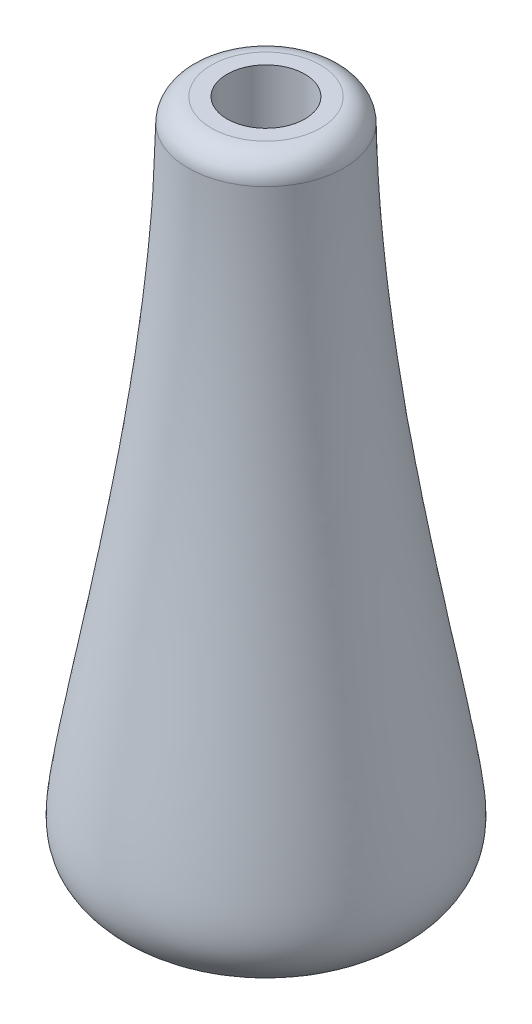
ISO-10303-21;
HEADER;
FILE_DESCRIPTION(('STEP AP214'),'2;1');
FILE_NAME('part.step','',(''),(''),'','','');
FILE_SCHEMA(('AUTOMOTIVE_DESIGN { 1 0 10303 214 1 1 1 1 }'));
ENDSEC;
DATA;
#1=APPLICATION_CONTEXT('core data for automotive mechanical design processes');
#2=APPLICATION_PROTOCOL_DEFINITION('international standard','automotive_design',2000,#1);
#3=PRODUCT_CONTEXT('',#1,'mechanical');
#4=PRODUCT('Part','Part','',(#3));
#5=PRODUCT_RELATED_PRODUCT_CATEGORY('part','',(#4));
#6=PRODUCT_DEFINITION_FORMATION('','',#4);
#7=PRODUCT_DEFINITION_CONTEXT('part definition',#1,'design');
#8=PRODUCT_DEFINITION('design','',#6,#7);
#9=PRODUCT_DEFINITION_SHAPE('','',#8);
#10=(LENGTH_UNIT() NAMED_UNIT(*) SI_UNIT(.MILLI.,.METRE.));
#11=(NAMED_UNIT(*) PLANE_ANGLE_UNIT() SI_UNIT($,.RADIAN.));
#12=(NAMED_UNIT(*) SI_UNIT($,.STERADIAN.) SOLID_ANGLE_UNIT());
#13=UNCERTAINTY_MEASURE_WITH_UNIT(LENGTH_MEASURE(1.E-05),#10,'distance_accuracy_value','');
#14=(GEOMETRIC_REPRESENTATION_CONTEXT(3) GLOBAL_UNCERTAINTY_ASSIGNED_CONTEXT((#13)) GLOBAL_UNIT_ASSIGNED_CONTEXT((#10,
#11,#12)) REPRESENTATION_CONTEXT('',''));
#15=CARTESIAN_POINT('',(0.,0.,0.));
#16=DIRECTION('',(0.,0.,1.));
#17=DIRECTION('',(1.,0.,0.));
#18=AXIS2_PLACEMENT_3D('',#15,#16,#17);
#19=CARTESIAN_POINT('',(0.,0.,0.));
#20=CARTESIAN_POINT('',(0.,0.,-9.00000000000006));
#21=CARTESIAN_POINT('',(0.,2.41487655261485,-20.9287572164624));
#22=CARTESIAN_POINT('',(0.,22.8052023997405,-18.8197593018413));
#23=CARTESIAN_POINT('',(0.,60.0000000000001,-10.));
#24=CARTESIAN_POINT('',(0.,90.0000000000001,-10.));
#25=B_SPLINE_CURVE_WITH_KNOTS('',3,(#19,#20,#21,#22,#23,#24),.UNSPECIFIED.,.F.,.F.,(4,1,1,4),
(0.,0.349968533469746,0.449968533469746,1.),.UNSPECIFIED.);
#26=CARTESIAN_POINT('',(0.,0.,0.));
#27=DIRECTION('',(0.,-1.,0.));
#28=AXIS1_PLACEMENT('',#26,#27);
#29=SURFACE_OF_REVOLUTION('',#25,#28);
#30=CARTESIAN_POINT('',(0.,87.0473988021494,0.));
#31=DIRECTION('',(0.,-1.,0.));
#32=DIRECTION('',(0.,0.,-1.));
#33=AXIS2_PLACEMENT_3D('',#30,#31,#32);
#34=CIRCLE('',#33,10.0235799718498);
#35=CARTESIAN_POINT('',(0.,87.0473988021494,-10.0235799718499));
#36=VERTEX_POINT('',#35);
#37=EDGE_CURVE('E47',#36,#36,#34,.T.);
#38=ORIENTED_EDGE('',*,*,#37,.T.);
#39=EDGE_LOOP('',(#38));
#40=FACE_BOUND('',#39,.T.);
#41=CARTESIAN_POINT('',(0.,0.,0.));
#42=VERTEX_POINT('',#41);
#43=VERTEX_LOOP('',#42);
#44=FACE_BOUND('',#43,.T.);
#45=ADVANCED_FACE('F40',(#40,#44),#29,.F.);
#46=CARTESIAN_POINT('',(0.,90.0000000000001,0.));
#47=DIRECTION('',(0.,1.,0.));
#48=DIRECTION('',(0.,0.,1.));
#49=AXIS2_PLACEMENT_3D('',#46,#47,#48);
#50=PLANE('',#49);
#51=CARTESIAN_POINT('',(0.,90.0000000000001,0.));
#52=DIRECTION('',(0.,1.,0.));
#53=DIRECTION('',(0.,0.,1.));
#54=AXIS2_PLACEMENT_3D('',#51,#52,#53);
#55=CIRCLE('',#54,7.0239544362946);
#56=CARTESIAN_POINT('',(0.,90.0000000000001,7.02395443629461));
#57=VERTEX_POINT('',#56);
#58=EDGE_CURVE('E11',#57,#57,#55,.T.);
#59=ORIENTED_EDGE('',*,*,#58,.T.);
#60=EDGE_LOOP('',(#59));
#61=FACE_BOUND('',#60,.T.);
#62=CARTESIAN_POINT('',(0.,90.0000000000001,0.));
#63=DIRECTION('',(0.,1.,0.));
#64=DIRECTION('',(0.,0.,1.));
#65=AXIS2_PLACEMENT_3D('',#62,#63,#64);
#66=CIRCLE('',#65,5.);
#67=CARTESIAN_POINT('',(0.,90.0000000000001,5.00000000000001));
#68=VERTEX_POINT('',#67);
#69=EDGE_CURVE('E66',#68,#68,#66,.T.);
#70=ORIENTED_EDGE('',*,*,#69,.F.);
#71=EDGE_LOOP('',(#70));
#72=FACE_BOUND('',#71,.T.);
#73=ADVANCED_FACE('F51',(#61,#72),#50,.T.);
#74=CARTESIAN_POINT('',(0.,20.0000000000011,0.));
#75=DIRECTION('',(0.,1.,0.));
#76=DIRECTION('',(0.,0.,1.));
#77=AXIS2_PLACEMENT_3D('',#74,#75,#76);
#78=CYLINDRICAL_SURFACE('',#77,5.);
#79=CARTESIAN_POINT('',(0.,20.0000000000011,0.));
#80=DIRECTION('',(0.,1.,0.));
#81=DIRECTION('',(0.,0.,1.));
#82=AXIS2_PLACEMENT_3D('',#79,#80,#81);
#83=CIRCLE('',#82,5.);
#84=CARTESIAN_POINT('',(0.,20.0000000000011,5.00000000000001));
#85=VERTEX_POINT('',#84);
#86=EDGE_CURVE('E71',#85,#85,#83,.T.);
#87=ORIENTED_EDGE('',*,*,#86,.F.);
#88=EDGE_LOOP('',(#87));
#89=FACE_BOUND('',#88,.T.);
#90=ORIENTED_EDGE('',*,*,#69,.T.);
#91=EDGE_LOOP('',(#90));
#92=FACE_BOUND('',#91,.T.);
#93=ADVANCED_FACE('F56',(#89,#92),#78,.F.);
#94=CARTESIAN_POINT('',(0.,20.0000000000011,0.));
#95=DIRECTION('',(0.,1.,0.));
#96=DIRECTION('',(0.,0.,1.));
#97=AXIS2_PLACEMENT_3D('',#94,#95,#96);
#98=PLANE('',#97);
#99=ORIENTED_EDGE('',*,*,#86,.T.);
#100=EDGE_LOOP('',(#99));
#101=FACE_BOUND('',#100,.T.);
#102=ADVANCED_FACE('F81',(#101),#98,.T.);
#103=CARTESIAN_POINT('',(0.,87.,0.));
#104=DIRECTION('',(0.,-1.,0.));
#105=DIRECTION('',(0.,0.,-1.));
#106=AXIS2_PLACEMENT_3D('',#103,#104,#105);
#107=TOROIDAL_SURFACE('',#106,7.0239544362946,3.);
#108=ORIENTED_EDGE('',*,*,#58,.F.);
#109=EDGE_LOOP('',(#108));
#110=FACE_BOUND('',#109,.T.);
#111=ORIENTED_EDGE('',*,*,#37,.F.);
#112=EDGE_LOOP('',(#111));
#113=FACE_BOUND('',#112,.T.);
#114=ADVANCED_FACE('F42',(#110,#113),#107,.T.);
#115=CLOSED_SHELL('',(#45,#73,#93,#102,#114));
#116=MANIFOLD_SOLID_BREP('B2',#115);
#117=ADVANCED_BREP_SHAPE_REPRESENTATION('',(#18,#116),#14);
#118=SHAPE_DEFINITION_REPRESENTATION(#9,#117);
ENDSEC;
END-ISO-10303-21;
